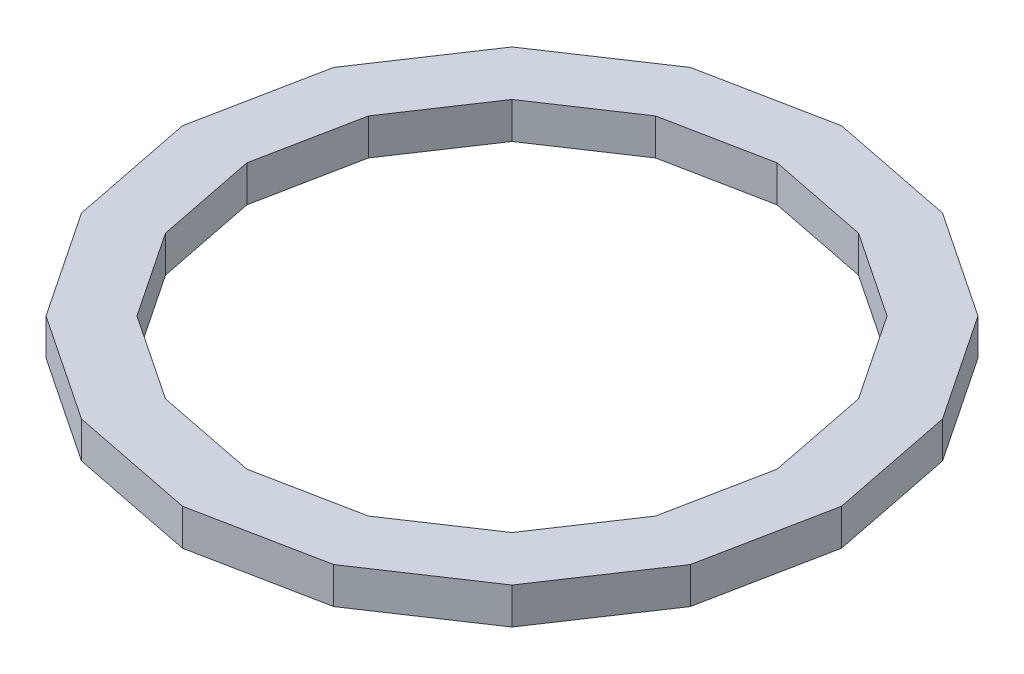
ISO-10303-21;
HEADER;
FILE_DESCRIPTION(('STEP AP214'),'2;1');
FILE_NAME('part.step','',(''),(''),'','','');
FILE_SCHEMA(('AUTOMOTIVE_DESIGN { 1 0 10303 214 1 1 1 1 }'));
ENDSEC;
DATA;
#1=APPLICATION_CONTEXT('core data for automotive mechanical design processes');
#2=APPLICATION_PROTOCOL_DEFINITION('international standard','automotive_design',2000,#1);
#3=PRODUCT_CONTEXT('',#1,'mechanical');
#4=PRODUCT('Part','Part','',(#3));
#5=PRODUCT_RELATED_PRODUCT_CATEGORY('part','',(#4));
#6=PRODUCT_DEFINITION_FORMATION('','',#4);
#7=PRODUCT_DEFINITION_CONTEXT('part definition',#1,'design');
#8=PRODUCT_DEFINITION('design','',#6,#7);
#9=PRODUCT_DEFINITION_SHAPE('','',#8);
#10=(LENGTH_UNIT() NAMED_UNIT(*) SI_UNIT(.MILLI.,.METRE.));
#11=(NAMED_UNIT(*) PLANE_ANGLE_UNIT() SI_UNIT($,.RADIAN.));
#12=(NAMED_UNIT(*) SI_UNIT($,.STERADIAN.) SOLID_ANGLE_UNIT());
#13=UNCERTAINTY_MEASURE_WITH_UNIT(LENGTH_MEASURE(1.E-05),#10,'distance_accuracy_value','');
#14=(GEOMETRIC_REPRESENTATION_CONTEXT(3) GLOBAL_UNCERTAINTY_ASSIGNED_CONTEXT((#13)) GLOBAL_UNIT_ASSIGNED_CONTEXT((#10,
#11,#12)) REPRESENTATION_CONTEXT('',''));
#15=CARTESIAN_POINT('',(0.,0.,0.));
#16=DIRECTION('',(0.,0.,1.));
#17=DIRECTION('',(1.,0.,0.));
#18=AXIS2_PLACEMENT_3D('',#15,#16,#17);
#19=CARTESIAN_POINT('',(0.,19.05,0.));
#20=DIRECTION('',(0.,1.,0.));
#21=DIRECTION('',(0.,0.,1.));
#22=AXIS2_PLACEMENT_3D('',#19,#20,#21);
#23=PLANE('',#22);
#24=DIRECTION('',(0.195090322016118,0.,-0.980785280403233));
#25=VECTOR('',#24,1.);
#26=CARTESIAN_POINT('',(159.378309212576,19.05,66.0166572239395));
#27=LINE('',#26,#25);
#28=CARTESIAN_POINT('',(159.378309212576,19.05,66.0166572239395));
#29=VERTEX_POINT('',#28);
#30=CARTESIAN_POINT('',(172.50983878748,19.05,-1.92207104317221E-12));
#31=VERTEX_POINT('',#30);
#32=EDGE_CURVE('E372',#29,#31,#27,.T.);
#33=ORIENTED_EDGE('',*,*,#32,.T.);
#34=DIRECTION('',(-0.19509032201614,0.,-0.980785280403228));
#35=VECTOR('',#34,1.);
#36=CARTESIAN_POINT('',(172.50983878748,19.05,-1.92207104317221E-12));
#37=LINE('',#36,#35);
#38=CARTESIAN_POINT('',(159.378309212574,19.05,-66.0166572239432));
#39=VERTEX_POINT('',#38);
#40=EDGE_CURVE('E375',#31,#39,#37,.T.);
#41=ORIENTED_EDGE('',*,*,#40,.T.);
#42=DIRECTION('',(-0.555570233019612,0.,-0.831469612302539));
#43=VECTOR('',#42,1.);
#44=CARTESIAN_POINT('',(159.378309212574,19.05,-66.0166572239432));
#45=LINE('',#44,#43);
#46=CARTESIAN_POINT('',(121.982876828024,19.05,-121.982876828027));
#47=VERTEX_POINT('',#46);
#48=EDGE_CURVE('E378',#39,#47,#45,.T.);
#49=ORIENTED_EDGE('',*,*,#48,.T.);
#50=DIRECTION('',(-0.831469612302552,0.,-0.555570233019593));
#51=VECTOR('',#50,1.);
#52=CARTESIAN_POINT('',(121.982876828024,19.05,-121.982876828027));
#53=LINE('',#52,#51);
#54=CARTESIAN_POINT('',(66.0166572239395,19.05,-159.378309212576));
#55=VERTEX_POINT('',#54);
#56=EDGE_CURVE('E380',#47,#55,#53,.T.);
#57=ORIENTED_EDGE('',*,*,#56,.T.);
#58=DIRECTION('',(-0.980785280403233,0.,-0.195090322016117));
#59=VECTOR('',#58,1.);
#60=CARTESIAN_POINT('',(66.0166572239395,19.05,-159.378309212576));
#61=LINE('',#60,#59);
#62=CARTESIAN_POINT('',(-1.90247239332931E-12,19.05,-172.50983878748));
#63=VERTEX_POINT('',#62);
#64=EDGE_CURVE('E382',#55,#63,#61,.T.);
#65=ORIENTED_EDGE('',*,*,#64,.T.);
#66=DIRECTION('',(-0.980785280403228,0.,0.19509032201614));
#67=VECTOR('',#66,1.);
#68=CARTESIAN_POINT('',(-1.90247239332931E-12,19.05,-172.50983878748));
#69=LINE('',#68,#67);
#70=CARTESIAN_POINT('',(-66.0166572239432,19.05,-159.378309212574));
#71=VERTEX_POINT('',#70);
#72=EDGE_CURVE('E384',#63,#71,#69,.T.);
#73=ORIENTED_EDGE('',*,*,#72,.T.);
#74=DIRECTION('',(-0.831469612302539,0.,0.555570233019612));
#75=VECTOR('',#74,1.);
#76=CARTESIAN_POINT('',(-66.0166572239432,19.05,-159.378309212574));
#77=LINE('',#76,#75);
#78=CARTESIAN_POINT('',(-121.982876828027,19.05,-121.982876828024));
#79=VERTEX_POINT('',#78);
#80=EDGE_CURVE('E386',#71,#79,#77,.T.);
#81=ORIENTED_EDGE('',*,*,#80,.T.);
#82=DIRECTION('',(-0.555570233019593,0.,0.831469612302552));
#83=VECTOR('',#82,1.);
#84=CARTESIAN_POINT('',(-121.982876828027,19.05,-121.982876828024));
#85=LINE('',#84,#83);
#86=CARTESIAN_POINT('',(-159.378309212576,19.05,-66.0166572239395));
#87=VERTEX_POINT('',#86);
#88=EDGE_CURVE('E388',#79,#87,#85,.T.);
#89=ORIENTED_EDGE('',*,*,#88,.T.);
#90=DIRECTION('',(-0.195090322016117,0.,0.980785280403233));
#91=VECTOR('',#90,1.);
#92=CARTESIAN_POINT('',(-159.378309212576,19.05,-66.0166572239395));
#93=LINE('',#92,#91);
#94=CARTESIAN_POINT('',(-172.50983878748,19.05,1.92980582097801E-12));
#95=VERTEX_POINT('',#94);
#96=EDGE_CURVE('E391',#87,#95,#93,.T.);
#97=ORIENTED_EDGE('',*,*,#96,.T.);
#98=DIRECTION('',(0.195090322016139,0.,0.980785280403228));
#99=VECTOR('',#98,1.);
#100=CARTESIAN_POINT('',(-172.50983878748,19.05,1.92980582097801E-12));
#101=LINE('',#100,#99);
#102=CARTESIAN_POINT('',(-159.378309212574,19.05,66.0166572239431));
#103=VERTEX_POINT('',#102);
#104=EDGE_CURVE('E393',#95,#103,#101,.T.);
#105=ORIENTED_EDGE('',*,*,#104,.T.);
#106=DIRECTION('',(0.555570233019612,0.,0.831469612302539));
#107=VECTOR('',#106,1.);
#108=CARTESIAN_POINT('',(-159.378309212574,19.05,66.0166572239431));
#109=LINE('',#108,#107);
#110=CARTESIAN_POINT('',(-121.982876828024,19.05,121.982876828027));
#111=VERTEX_POINT('',#110);
#112=EDGE_CURVE('E395',#103,#111,#109,.T.);
#113=ORIENTED_EDGE('',*,*,#112,.T.);
#114=DIRECTION('',(0.831469612302552,0.,0.555570233019593));
#115=VECTOR('',#114,1.);
#116=CARTESIAN_POINT('',(-121.982876828024,19.05,121.982876828027));
#117=LINE('',#116,#115);
#118=CARTESIAN_POINT('',(-66.0166572239395,19.05,159.378309212576));
#119=VERTEX_POINT('',#118);
#120=EDGE_CURVE('E398',#111,#119,#117,.T.);
#121=ORIENTED_EDGE('',*,*,#120,.T.);
#122=DIRECTION('',(0.980785280403233,0.,0.195090322016117));
#123=VECTOR('',#122,1.);
#124=CARTESIAN_POINT('',(-66.0166572239395,19.05,159.378309212576));
#125=LINE('',#124,#123);
#126=CARTESIAN_POINT('',(1.87475637863345E-12,19.05,172.50983878748));
#127=VERTEX_POINT('',#126);
#128=EDGE_CURVE('E401',#119,#127,#125,.T.);
#129=ORIENTED_EDGE('',*,*,#128,.T.);
#130=DIRECTION('',(0.980785280403228,0.,-0.19509032201614));
#131=VECTOR('',#130,1.);
#132=CARTESIAN_POINT('',(1.87475637863345E-12,19.05,172.50983878748));
#133=LINE('',#132,#131);
#134=CARTESIAN_POINT('',(66.0166572239431,19.05,159.378309212574));
#135=VERTEX_POINT('',#134);
#136=EDGE_CURVE('E403',#127,#135,#133,.T.);
#137=ORIENTED_EDGE('',*,*,#136,.T.);
#138=DIRECTION('',(0.831469612302539,0.,-0.555570233019612));
#139=VECTOR('',#138,1.);
#140=CARTESIAN_POINT('',(66.0166572239431,19.05,159.378309212574));
#141=LINE('',#140,#139);
#142=CARTESIAN_POINT('',(121.982876828027,19.05,121.982876828024));
#143=VERTEX_POINT('',#142);
#144=EDGE_CURVE('E406',#135,#143,#141,.T.);
#145=ORIENTED_EDGE('',*,*,#144,.T.);
#146=DIRECTION('',(0.555570233019593,0.,-0.831469612302551));
#147=VECTOR('',#146,1.);
#148=CARTESIAN_POINT('',(121.982876828027,19.05,121.982876828024));
#149=LINE('',#148,#147);
#150=EDGE_CURVE('E409',#143,#29,#149,.T.);
#151=ORIENTED_EDGE('',*,*,#150,.T.);
#152=EDGE_LOOP('',(#33,#41,#49,#57,#65,#73,#81,#89,#97,#105,#113,#121,#129,#137,#145,#151));
#153=FACE_BOUND('',#152,.T.);
#154=DIRECTION('',(-0.19509032201614,0.,-0.980785280403228));
#155=VECTOR('',#154,1.);
#156=CARTESIAN_POINT('',(138.842938743442,19.05,-1.68605097273448E-12));
#157=LINE('',#156,#155);
#158=CARTESIAN_POINT('',(138.842938743442,19.05,-1.68605097273448E-12));
#159=VERTEX_POINT('',#158);
#160=CARTESIAN_POINT('',(128.274149338784,19.05,-53.1328923579977));
#161=VERTEX_POINT('',#160);
#162=EDGE_CURVE('E252',#159,#161,#157,.T.);
#163=ORIENTED_EDGE('',*,*,#162,.F.);
#164=DIRECTION('',(0.195090322016117,0.,-0.980785280403233));
#165=VECTOR('',#164,1.);
#166=CARTESIAN_POINT('',(128.274149338785,19.05,53.1328923579948));
#167=LINE('',#166,#165);
#168=CARTESIAN_POINT('',(128.274149338785,19.05,53.1328923579948));
#169=VERTEX_POINT('',#168);
#170=EDGE_CURVE('E243',#169,#159,#167,.T.);
#171=ORIENTED_EDGE('',*,*,#170,.F.);
#172=DIRECTION('',(0.555570233019593,0.,-0.831469612302552));
#173=VECTOR('',#172,1.);
#174=CARTESIAN_POINT('',(98.1767835053572,19.05,98.176783505355));
#175=LINE('',#174,#173);
#176=CARTESIAN_POINT('',(98.1767835053573,19.05,98.176783505355));
#177=VERTEX_POINT('',#176);
#178=EDGE_CURVE('E297',#177,#169,#175,.T.);
#179=ORIENTED_EDGE('',*,*,#178,.F.);
#180=DIRECTION('',(0.831469612302539,0.,-0.555570233019612));
#181=VECTOR('',#180,1.);
#182=CARTESIAN_POINT('',(53.1328923579976,19.05,128.274149338784));
#183=LINE('',#182,#181);
#184=CARTESIAN_POINT('',(53.1328923579976,19.05,128.274149338784));
#185=VERTEX_POINT('',#184);
#186=EDGE_CURVE('E295',#185,#177,#183,.T.);
#187=ORIENTED_EDGE('',*,*,#186,.F.);
#188=DIRECTION('',(0.980785280403228,0.,-0.195090322016139));
#189=VECTOR('',#188,1.);
#190=CARTESIAN_POINT('',(1.57183347493308E-12,19.05,138.842938743442));
#191=LINE('',#190,#189);
#192=CARTESIAN_POINT('',(1.57183347493308E-12,19.05,138.842938743442));
#193=VERTEX_POINT('',#192);
#194=EDGE_CURVE('E293',#193,#185,#191,.T.);
#195=ORIENTED_EDGE('',*,*,#194,.F.);
#196=DIRECTION('',(0.980785280403233,0.,0.195090322016117));
#197=VECTOR('',#196,1.);
#198=CARTESIAN_POINT('',(-53.1328923579948,19.05,128.274149338785));
#199=LINE('',#198,#197);
#200=CARTESIAN_POINT('',(-53.1328923579948,19.05,128.274149338785));
#201=VERTEX_POINT('',#200);
#202=EDGE_CURVE('E290',#201,#193,#199,.T.);
#203=ORIENTED_EDGE('',*,*,#202,.F.);
#204=DIRECTION('',(0.831469612302551,0.,0.555570233019593));
#205=VECTOR('',#204,1.);
#206=CARTESIAN_POINT('',(-98.1767835053551,19.05,98.1767835053572));
#207=LINE('',#206,#205);
#208=CARTESIAN_POINT('',(-98.1767835053551,19.05,98.1767835053572));
#209=VERTEX_POINT('',#208);
#210=EDGE_CURVE('E288',#209,#201,#207,.T.);
#211=ORIENTED_EDGE('',*,*,#210,.F.);
#212=DIRECTION('',(0.555570233019612,0.,0.831469612302539));
#213=VECTOR('',#212,1.);
#214=CARTESIAN_POINT('',(-128.274149338784,19.05,53.1328923579977));
#215=LINE('',#214,#213);
#216=CARTESIAN_POINT('',(-128.274149338784,19.05,53.1328923579977));
#217=VERTEX_POINT('',#216);
#218=EDGE_CURVE('E286',#217,#209,#215,.T.);
#219=ORIENTED_EDGE('',*,*,#218,.F.);
#220=DIRECTION('',(0.19509032201614,0.,0.980785280403228));
#221=VECTOR('',#220,1.);
#222=CARTESIAN_POINT('',(-138.842938743442,19.05,1.59554962231287E-12));
#223=LINE('',#222,#221);
#224=CARTESIAN_POINT('',(-138.842938743442,19.05,1.59554962231287E-12));
#225=VERTEX_POINT('',#224);
#226=EDGE_CURVE('E284',#225,#217,#223,.T.);
#227=ORIENTED_EDGE('',*,*,#226,.F.);
#228=DIRECTION('',(-0.195090322016117,0.,0.980785280403233));
#229=VECTOR('',#228,1.);
#230=CARTESIAN_POINT('',(-128.274149338785,19.05,-53.1328923579948));
#231=LINE('',#230,#229);
#232=CARTESIAN_POINT('',(-128.274149338785,19.05,-53.1328923579948));
#233=VERTEX_POINT('',#232);
#234=EDGE_CURVE('E281',#233,#225,#231,.T.);
#235=ORIENTED_EDGE('',*,*,#234,.F.);
#236=DIRECTION('',(-0.555570233019593,0.,0.831469612302552));
#237=VECTOR('',#236,1.);
#238=CARTESIAN_POINT('',(-98.1767835053574,19.05,-98.176783505355));
#239=LINE('',#238,#237);
#240=CARTESIAN_POINT('',(-98.1767835053574,19.05,-98.176783505355));
#241=VERTEX_POINT('',#240);
#242=EDGE_CURVE('E278',#241,#233,#239,.T.);
#243=ORIENTED_EDGE('',*,*,#242,.F.);
#244=DIRECTION('',(-0.831469612302539,0.,0.555570233019612));
#245=VECTOR('',#244,1.);
#246=CARTESIAN_POINT('',(-53.1328923579977,19.05,-128.274149338784));
#247=LINE('',#246,#245);
#248=CARTESIAN_POINT('',(-53.1328923579977,19.05,-128.274149338784));
#249=VERTEX_POINT('',#248);
#250=EDGE_CURVE('E276',#249,#241,#247,.T.);
#251=ORIENTED_EDGE('',*,*,#250,.F.);
#252=DIRECTION('',(-0.980785280403228,0.,0.19509032201614));
#253=VECTOR('',#252,1.);
#254=CARTESIAN_POINT('',(-1.60267763885593E-12,19.05,-138.842938743442));
#255=LINE('',#254,#253);
#256=CARTESIAN_POINT('',(-1.60267763885593E-12,19.05,-138.842938743442));
#257=VERTEX_POINT('',#256);
#258=EDGE_CURVE('E273',#257,#249,#255,.T.);
#259=ORIENTED_EDGE('',*,*,#258,.F.);
#260=DIRECTION('',(-0.980785280403233,0.,-0.195090322016117));
#261=VECTOR('',#260,1.);
#262=CARTESIAN_POINT('',(53.1328923579946,19.05,-128.274149338785));
#263=LINE('',#262,#261);
#264=CARTESIAN_POINT('',(53.1328923579946,19.05,-128.274149338785));
#265=VERTEX_POINT('',#264);
#266=EDGE_CURVE('E271',#265,#257,#263,.T.);
#267=ORIENTED_EDGE('',*,*,#266,.F.);
#268=DIRECTION('',(-0.831469612302552,0.,-0.555570233019593));
#269=VECTOR('',#268,1.);
#270=CARTESIAN_POINT('',(98.176783505355,19.05,-98.1767835053572));
#271=LINE('',#270,#269);
#272=CARTESIAN_POINT('',(98.176783505355,19.05,-98.1767835053572));
#273=VERTEX_POINT('',#272);
#274=EDGE_CURVE('E267',#273,#265,#271,.T.);
#275=ORIENTED_EDGE('',*,*,#274,.F.);
#276=DIRECTION('',(-0.555570233019612,0.,-0.831469612302539));
#277=VECTOR('',#276,1.);
#278=CARTESIAN_POINT('',(128.274149338784,19.05,-53.1328923579977));
#279=LINE('',#278,#277);
#280=EDGE_CURVE('E265',#161,#273,#279,.T.);
#281=ORIENTED_EDGE('',*,*,#280,.F.);
#282=EDGE_LOOP('',(#163,#171,#179,#187,#195,#203,#211,#219,#227,#235,#243,#251,#259,#267,#275,#281));
#283=FACE_BOUND('',#282,.T.);
#284=ADVANCED_FACE('F34',(#153,#283),#23,.T.);
#285=CARTESIAN_POINT('',(0.,0.,0.));
#286=DIRECTION('',(0.,1.,0.));
#287=DIRECTION('',(0.,0.,1.));
#288=AXIS2_PLACEMENT_3D('',#285,#286,#287);
#289=PLANE('',#288);
#290=DIRECTION('',(0.195090322016118,0.,-0.980785280403233));
#291=VECTOR('',#290,1.);
#292=CARTESIAN_POINT('',(159.378309212576,0.,66.0166572239395));
#293=LINE('',#292,#291);
#294=CARTESIAN_POINT('',(159.378309212576,0.,66.0166572239395));
#295=VERTEX_POINT('',#294);
#296=CARTESIAN_POINT('',(172.50983878748,0.,-1.92207104317221E-12));
#297=VERTEX_POINT('',#296);
#298=EDGE_CURVE('E260',#295,#297,#293,.T.);
#299=ORIENTED_EDGE('',*,*,#298,.F.);
#300=DIRECTION('',(0.555570233019593,0.,-0.831469612302551));
#301=VECTOR('',#300,1.);
#302=CARTESIAN_POINT('',(121.982876828027,0.,121.982876828024));
#303=LINE('',#302,#301);
#304=CARTESIAN_POINT('',(121.982876828027,0.,121.982876828024));
#305=VERTEX_POINT('',#304);
#306=EDGE_CURVE('E376',#305,#295,#303,.T.);
#307=ORIENTED_EDGE('',*,*,#306,.F.);
#308=DIRECTION('',(0.831469612302539,0.,-0.555570233019612));
#309=VECTOR('',#308,1.);
#310=CARTESIAN_POINT('',(66.0166572239431,0.,159.378309212574));
#311=LINE('',#310,#309);
#312=CARTESIAN_POINT('',(66.0166572239431,0.,159.378309212574));
#313=VERTEX_POINT('',#312);
#314=EDGE_CURVE('E446',#313,#305,#311,.T.);
#315=ORIENTED_EDGE('',*,*,#314,.F.);
#316=DIRECTION('',(0.980785280403228,0.,-0.19509032201614));
#317=VECTOR('',#316,1.);
#318=CARTESIAN_POINT('',(1.87475637863345E-12,0.,172.50983878748));
#319=LINE('',#318,#317);
#320=CARTESIAN_POINT('',(1.87475637863345E-12,0.,172.50983878748));
#321=VERTEX_POINT('',#320);
#322=EDGE_CURVE('E443',#321,#313,#319,.T.);
#323=ORIENTED_EDGE('',*,*,#322,.F.);
#324=DIRECTION('',(0.980785280403233,0.,0.195090322016117));
#325=VECTOR('',#324,1.);
#326=CARTESIAN_POINT('',(-66.0166572239395,0.,159.378309212576));
#327=LINE('',#326,#325);
#328=CARTESIAN_POINT('',(-66.0166572239395,0.,159.378309212576));
#329=VERTEX_POINT('',#328);
#330=EDGE_CURVE('E440',#329,#321,#327,.T.);
#331=ORIENTED_EDGE('',*,*,#330,.F.);
#332=DIRECTION('',(0.831469612302552,0.,0.555570233019593));
#333=VECTOR('',#332,1.);
#334=CARTESIAN_POINT('',(-121.982876828024,0.,121.982876828027));
#335=LINE('',#334,#333);
#336=CARTESIAN_POINT('',(-121.982876828024,0.,121.982876828027));
#337=VERTEX_POINT('',#336);
#338=EDGE_CURVE('E437',#337,#329,#335,.T.);
#339=ORIENTED_EDGE('',*,*,#338,.F.);
#340=DIRECTION('',(0.555570233019612,0.,0.831469612302539));
#341=VECTOR('',#340,1.);
#342=CARTESIAN_POINT('',(-159.378309212574,0.,66.0166572239431));
#343=LINE('',#342,#341);
#344=CARTESIAN_POINT('',(-159.378309212574,0.,66.0166572239431));
#345=VERTEX_POINT('',#344);
#346=EDGE_CURVE('E435',#345,#337,#343,.T.);
#347=ORIENTED_EDGE('',*,*,#346,.F.);
#348=DIRECTION('',(0.195090322016139,0.,0.980785280403228));
#349=VECTOR('',#348,1.);
#350=CARTESIAN_POINT('',(-172.50983878748,0.,1.92980582097801E-12));
#351=LINE('',#350,#349);
#352=CARTESIAN_POINT('',(-172.50983878748,0.,1.92980582097801E-12));
#353=VERTEX_POINT('',#352);
#354=EDGE_CURVE('E432',#353,#345,#351,.T.);
#355=ORIENTED_EDGE('',*,*,#354,.F.);
#356=DIRECTION('',(-0.195090322016117,0.,0.980785280403233));
#357=VECTOR('',#356,1.);
#358=CARTESIAN_POINT('',(-159.378309212576,0.,-66.0166572239395));
#359=LINE('',#358,#357);
#360=CARTESIAN_POINT('',(-159.378309212576,0.,-66.0166572239395));
#361=VERTEX_POINT('',#360);
#362=EDGE_CURVE('E429',#361,#353,#359,.T.);
#363=ORIENTED_EDGE('',*,*,#362,.F.);
#364=DIRECTION('',(-0.555570233019593,0.,0.831469612302552));
#365=VECTOR('',#364,1.);
#366=CARTESIAN_POINT('',(-121.982876828027,0.,-121.982876828024));
#367=LINE('',#366,#365);
#368=CARTESIAN_POINT('',(-121.982876828027,0.,-121.982876828024));
#369=VERTEX_POINT('',#368);
#370=EDGE_CURVE('E426',#369,#361,#367,.T.);
#371=ORIENTED_EDGE('',*,*,#370,.F.);
#372=DIRECTION('',(-0.831469612302539,0.,0.555570233019612));
#373=VECTOR('',#372,1.);
#374=CARTESIAN_POINT('',(-66.0166572239432,0.,-159.378309212574));
#375=LINE('',#374,#373);
#376=CARTESIAN_POINT('',(-66.0166572239432,0.,-159.378309212574));
#377=VERTEX_POINT('',#376);
#378=EDGE_CURVE('E424',#377,#369,#375,.T.);
#379=ORIENTED_EDGE('',*,*,#378,.F.);
#380=DIRECTION('',(-0.980785280403228,0.,0.19509032201614));
#381=VECTOR('',#380,1.);
#382=CARTESIAN_POINT('',(-1.90247239332931E-12,0.,-172.50983878748));
#383=LINE('',#382,#381);
#384=CARTESIAN_POINT('',(-1.90247239332931E-12,0.,-172.50983878748));
#385=VERTEX_POINT('',#384);
#386=EDGE_CURVE('E422',#385,#377,#383,.T.);
#387=ORIENTED_EDGE('',*,*,#386,.F.);
#388=DIRECTION('',(-0.980785280403233,0.,-0.195090322016117));
#389=VECTOR('',#388,1.);
#390=CARTESIAN_POINT('',(66.0166572239395,0.,-159.378309212576));
#391=LINE('',#390,#389);
#392=CARTESIAN_POINT('',(66.0166572239395,0.,-159.378309212576));
#393=VERTEX_POINT('',#392);
#394=EDGE_CURVE('E420',#393,#385,#391,.T.);
#395=ORIENTED_EDGE('',*,*,#394,.F.);
#396=DIRECTION('',(-0.831469612302552,0.,-0.555570233019593));
#397=VECTOR('',#396,1.);
#398=CARTESIAN_POINT('',(121.982876828024,0.,-121.982876828027));
#399=LINE('',#398,#397);
#400=CARTESIAN_POINT('',(121.982876828024,0.,-121.982876828027));
#401=VERTEX_POINT('',#400);
#402=EDGE_CURVE('E418',#401,#393,#399,.T.);
#403=ORIENTED_EDGE('',*,*,#402,.F.);
#404=DIRECTION('',(-0.555570233019612,0.,-0.831469612302539));
#405=VECTOR('',#404,1.);
#406=CARTESIAN_POINT('',(159.378309212574,0.,-66.0166572239432));
#407=LINE('',#406,#405);
#408=CARTESIAN_POINT('',(159.378309212574,0.,-66.0166572239432));
#409=VERTEX_POINT('',#408);
#410=EDGE_CURVE('E416',#409,#401,#407,.T.);
#411=ORIENTED_EDGE('',*,*,#410,.F.);
#412=DIRECTION('',(-0.19509032201614,0.,-0.980785280403228));
#413=VECTOR('',#412,1.);
#414=CARTESIAN_POINT('',(172.50983878748,0.,-1.92207104317221E-12));
#415=LINE('',#414,#413);
#416=EDGE_CURVE('E414',#297,#409,#415,.T.);
#417=ORIENTED_EDGE('',*,*,#416,.F.);
#418=EDGE_LOOP('',(#299,#307,#315,#323,#331,#339,#347,#355,#363,#371,#379,#387,#395,#403,#411,#417));
#419=FACE_BOUND('',#418,.T.);
#420=DIRECTION('',(0.195090322016117,0.,-0.980785280403233));
#421=VECTOR('',#420,1.);
#422=CARTESIAN_POINT('',(128.274149338785,0.,53.1328923579948));
#423=LINE('',#422,#421);
#424=CARTESIAN_POINT('',(128.274149338785,0.,53.1328923579948));
#425=VERTEX_POINT('',#424);
#426=CARTESIAN_POINT('',(138.842938743442,0.,-1.68605097273448E-12));
#427=VERTEX_POINT('',#426);
#428=EDGE_CURVE('E57',#425,#427,#423,.T.);
#429=ORIENTED_EDGE('',*,*,#428,.T.);
#430=DIRECTION('',(-0.19509032201614,0.,-0.980785280403228));
#431=VECTOR('',#430,1.);
#432=CARTESIAN_POINT('',(138.842938743442,0.,-1.68605097273448E-12));
#433=LINE('',#432,#431);
#434=CARTESIAN_POINT('',(128.274149338784,0.,-53.1328923579977));
#435=VERTEX_POINT('',#434);
#436=EDGE_CURVE('E259',#427,#435,#433,.T.);
#437=ORIENTED_EDGE('',*,*,#436,.T.);
#438=DIRECTION('',(-0.555570233019612,0.,-0.831469612302539));
#439=VECTOR('',#438,1.);
#440=CARTESIAN_POINT('',(128.274149338784,0.,-53.1328923579977));
#441=LINE('',#440,#439);
#442=CARTESIAN_POINT('',(98.176783505355,0.,-98.1767835053572));
#443=VERTEX_POINT('',#442);
#444=EDGE_CURVE('E301',#435,#443,#441,.T.);
#445=ORIENTED_EDGE('',*,*,#444,.T.);
#446=DIRECTION('',(-0.831469612302552,0.,-0.555570233019593));
#447=VECTOR('',#446,1.);
#448=CARTESIAN_POINT('',(98.176783505355,0.,-98.1767835053572));
#449=LINE('',#448,#447);
#450=CARTESIAN_POINT('',(53.1328923579946,0.,-128.274149338785));
#451=VERTEX_POINT('',#450);
#452=EDGE_CURVE('E304',#443,#451,#449,.T.);
#453=ORIENTED_EDGE('',*,*,#452,.T.);
#454=DIRECTION('',(-0.980785280403233,0.,-0.195090322016117));
#455=VECTOR('',#454,1.);
#456=CARTESIAN_POINT('',(53.1328923579946,0.,-128.274149338785));
#457=LINE('',#456,#455);
#458=CARTESIAN_POINT('',(-1.60267763885593E-12,0.,-138.842938743442));
#459=VERTEX_POINT('',#458);
#460=EDGE_CURVE('E307',#451,#459,#457,.T.);
#461=ORIENTED_EDGE('',*,*,#460,.T.);
#462=DIRECTION('',(-0.980785280403228,0.,0.19509032201614));
#463=VECTOR('',#462,1.);
#464=CARTESIAN_POINT('',(-1.60267763885593E-12,0.,-138.842938743442));
#465=LINE('',#464,#463);
#466=CARTESIAN_POINT('',(-53.1328923579977,0.,-128.274149338784));
#467=VERTEX_POINT('',#466);
#468=EDGE_CURVE('E310',#459,#467,#465,.T.);
#469=ORIENTED_EDGE('',*,*,#468,.T.);
#470=DIRECTION('',(-0.831469612302539,0.,0.555570233019612));
#471=VECTOR('',#470,1.);
#472=CARTESIAN_POINT('',(-53.1328923579977,0.,-128.274149338784));
#473=LINE('',#472,#471);
#474=CARTESIAN_POINT('',(-98.1767835053574,0.,-98.176783505355));
#475=VERTEX_POINT('',#474);
#476=EDGE_CURVE('E313',#467,#475,#473,.T.);
#477=ORIENTED_EDGE('',*,*,#476,.T.);
#478=DIRECTION('',(-0.555570233019593,0.,0.831469612302552));
#479=VECTOR('',#478,1.);
#480=CARTESIAN_POINT('',(-98.1767835053574,0.,-98.176783505355));
#481=LINE('',#480,#479);
#482=CARTESIAN_POINT('',(-128.274149338785,0.,-53.1328923579948));
#483=VERTEX_POINT('',#482);
#484=EDGE_CURVE('E316',#475,#483,#481,.T.);
#485=ORIENTED_EDGE('',*,*,#484,.T.);
#486=DIRECTION('',(-0.195090322016117,0.,0.980785280403233));
#487=VECTOR('',#486,1.);
#488=CARTESIAN_POINT('',(-128.274149338785,0.,-53.1328923579948));
#489=LINE('',#488,#487);
#490=CARTESIAN_POINT('',(-138.842938743442,0.,1.59554962231287E-12));
#491=VERTEX_POINT('',#490);
#492=EDGE_CURVE('E319',#483,#491,#489,.T.);
#493=ORIENTED_EDGE('',*,*,#492,.T.);
#494=DIRECTION('',(0.19509032201614,0.,0.980785280403228));
#495=VECTOR('',#494,1.);
#496=CARTESIAN_POINT('',(-138.842938743442,0.,1.59554962231287E-12));
#497=LINE('',#496,#495);
#498=CARTESIAN_POINT('',(-128.274149338784,0.,53.1328923579977));
#499=VERTEX_POINT('',#498);
#500=EDGE_CURVE('E323',#491,#499,#497,.T.);
#501=ORIENTED_EDGE('',*,*,#500,.T.);
#502=DIRECTION('',(0.555570233019612,0.,0.831469612302539));
#503=VECTOR('',#502,1.);
#504=CARTESIAN_POINT('',(-128.274149338784,0.,53.1328923579977));
#505=LINE('',#504,#503);
#506=CARTESIAN_POINT('',(-98.1767835053551,0.,98.1767835053572));
#507=VERTEX_POINT('',#506);
#508=EDGE_CURVE('E326',#499,#507,#505,.T.);
#509=ORIENTED_EDGE('',*,*,#508,.T.);
#510=DIRECTION('',(0.831469612302551,0.,0.555570233019593));
#511=VECTOR('',#510,1.);
#512=CARTESIAN_POINT('',(-98.1767835053551,0.,98.1767835053572));
#513=LINE('',#512,#511);
#514=CARTESIAN_POINT('',(-53.1328923579948,0.,128.274149338785));
#515=VERTEX_POINT('',#514);
#516=EDGE_CURVE('E329',#507,#515,#513,.T.);
#517=ORIENTED_EDGE('',*,*,#516,.T.);
#518=DIRECTION('',(0.980785280403233,0.,0.195090322016117));
#519=VECTOR('',#518,1.);
#520=CARTESIAN_POINT('',(-53.1328923579948,0.,128.274149338785));
#521=LINE('',#520,#519);
#522=CARTESIAN_POINT('',(1.57183347493308E-12,0.,138.842938743442));
#523=VERTEX_POINT('',#522);
#524=EDGE_CURVE('E332',#515,#523,#521,.T.);
#525=ORIENTED_EDGE('',*,*,#524,.T.);
#526=DIRECTION('',(0.980785280403228,0.,-0.195090322016139));
#527=VECTOR('',#526,1.);
#528=CARTESIAN_POINT('',(1.57183347493308E-12,0.,138.842938743442));
#529=LINE('',#528,#527);
#530=CARTESIAN_POINT('',(53.1328923579976,0.,128.274149338784));
#531=VERTEX_POINT('',#530);
#532=EDGE_CURVE('E335',#523,#531,#529,.T.);
#533=ORIENTED_EDGE('',*,*,#532,.T.);
#534=DIRECTION('',(0.831469612302539,0.,-0.555570233019612));
#535=VECTOR('',#534,1.);
#536=CARTESIAN_POINT('',(53.1328923579976,0.,128.274149338784));
#537=LINE('',#536,#535);
#538=CARTESIAN_POINT('',(98.1767835053572,0.,98.176783505355));
#539=VERTEX_POINT('',#538);
#540=EDGE_CURVE('E338',#531,#539,#537,.T.);
#541=ORIENTED_EDGE('',*,*,#540,.T.);
#542=DIRECTION('',(0.555570233019593,0.,-0.831469612302552));
#543=VECTOR('',#542,1.);
#544=CARTESIAN_POINT('',(98.1767835053572,0.,98.176783505355));
#545=LINE('',#544,#543);
#546=EDGE_CURVE('E253',#539,#425,#545,.T.);
#547=ORIENTED_EDGE('',*,*,#546,.T.);
#548=EDGE_LOOP('',(#429,#437,#445,#453,#461,#469,#477,#485,#493,#501,#509,#517,#525,#533,#541,#547));
#549=FACE_BOUND('',#548,.T.);
#550=ADVANCED_FACE('F503',(#419,#549),#289,.F.);
#551=CARTESIAN_POINT('',(159.378309212576,19.05,66.0166572239395));
#552=DIRECTION('',(-0.980785280403233,0.,-0.195090322016118));
#553=DIRECTION('',(-0.195090322016118,0.,0.980785280403233));
#554=AXIS2_PLACEMENT_3D('',#551,#552,#553);
#555=PLANE('',#554);
#556=ORIENTED_EDGE('',*,*,#298,.T.);
#557=DIRECTION('',(0.,-1.,0.));
#558=VECTOR('',#557,1.);
#559=CARTESIAN_POINT('',(172.50983878748,19.05,-1.92207104317221E-12));
#560=LINE('',#559,#558);
#561=EDGE_CURVE('E11',#31,#297,#560,.T.);
#562=ORIENTED_EDGE('',*,*,#561,.F.);
#563=ORIENTED_EDGE('',*,*,#32,.F.);
#564=DIRECTION('',(0.,-1.,0.));
#565=VECTOR('',#564,1.);
#566=CARTESIAN_POINT('',(159.378309212576,19.05,66.0166572239395));
#567=LINE('',#566,#565);
#568=EDGE_CURVE('E411',#29,#295,#567,.T.);
#569=ORIENTED_EDGE('',*,*,#568,.T.);
#570=EDGE_LOOP('',(#556,#562,#563,#569));
#571=FACE_BOUND('',#570,.T.);
#572=ADVANCED_FACE('F36',(#571),#555,.F.);
#573=CARTESIAN_POINT('',(172.50983878748,19.05,-1.92207104317221E-12));
#574=DIRECTION('',(-0.980785280403228,0.,0.19509032201614));
#575=DIRECTION('',(0.19509032201614,0.,0.980785280403228));
#576=AXIS2_PLACEMENT_3D('',#573,#574,#575);
#577=PLANE('',#576);
#578=ORIENTED_EDGE('',*,*,#416,.T.);
#579=DIRECTION('',(0.,-1.,0.));
#580=VECTOR('',#579,1.);
#581=CARTESIAN_POINT('',(159.378309212574,19.05,-66.0166572239432));
#582=LINE('',#581,#580);
#583=EDGE_CURVE('E42',#39,#409,#582,.T.);
#584=ORIENTED_EDGE('',*,*,#583,.F.);
#585=ORIENTED_EDGE('',*,*,#40,.F.);
#586=ORIENTED_EDGE('',*,*,#561,.T.);
#587=EDGE_LOOP('',(#578,#584,#585,#586));
#588=FACE_BOUND('',#587,.T.);
#589=ADVANCED_FACE('F520',(#588),#577,.F.);
#590=CARTESIAN_POINT('',(159.378309212574,19.05,-66.0166572239432));
#591=DIRECTION('',(-0.831469612302539,0.,0.555570233019612));
#592=DIRECTION('',(0.555570233019612,0.,0.831469612302539));
#593=AXIS2_PLACEMENT_3D('',#590,#591,#592);
#594=PLANE('',#593);
#595=ORIENTED_EDGE('',*,*,#410,.T.);
#596=DIRECTION('',(0.,-1.,0.));
#597=VECTOR('',#596,1.);
#598=CARTESIAN_POINT('',(121.982876828024,19.05,-121.982876828027));
#599=LINE('',#598,#597);
#600=EDGE_CURVE('E490',#47,#401,#599,.T.);
#601=ORIENTED_EDGE('',*,*,#600,.F.);
#602=ORIENTED_EDGE('',*,*,#48,.F.);
#603=ORIENTED_EDGE('',*,*,#583,.T.);
#604=EDGE_LOOP('',(#595,#601,#602,#603));
#605=FACE_BOUND('',#604,.T.);
#606=ADVANCED_FACE('F497',(#605),#594,.F.);
#607=CARTESIAN_POINT('',(121.982876828024,19.05,-121.982876828027));
#608=DIRECTION('',(-0.555570233019593,0.,0.831469612302552));
#609=DIRECTION('',(0.831469612302552,0.,0.555570233019593));
#610=AXIS2_PLACEMENT_3D('',#607,#608,#609);
#611=PLANE('',#610);
#612=ORIENTED_EDGE('',*,*,#402,.T.);
#613=DIRECTION('',(0.,-1.,0.));
#614=VECTOR('',#613,1.);
#615=CARTESIAN_POINT('',(66.0166572239395,19.05,-159.378309212576));
#616=LINE('',#615,#614);
#617=EDGE_CURVE('E486',#55,#393,#616,.T.);
#618=ORIENTED_EDGE('',*,*,#617,.F.);
#619=ORIENTED_EDGE('',*,*,#56,.F.);
#620=ORIENTED_EDGE('',*,*,#600,.T.);
#621=EDGE_LOOP('',(#612,#618,#619,#620));
#622=FACE_BOUND('',#621,.T.);
#623=ADVANCED_FACE('F509',(#622),#611,.F.);
#624=CARTESIAN_POINT('',(66.0166572239395,19.05,-159.378309212576));
#625=DIRECTION('',(-0.195090322016117,0.,0.980785280403233));
#626=DIRECTION('',(0.980785280403233,0.,0.195090322016117));
#627=AXIS2_PLACEMENT_3D('',#624,#625,#626);
#628=PLANE('',#627);
#629=ORIENTED_EDGE('',*,*,#394,.T.);
#630=DIRECTION('',(0.,-1.,0.));
#631=VECTOR('',#630,1.);
#632=CARTESIAN_POINT('',(-1.90247239332931E-12,19.05,-172.50983878748));
#633=LINE('',#632,#631);
#634=EDGE_CURVE('E483',#63,#385,#633,.T.);
#635=ORIENTED_EDGE('',*,*,#634,.F.);
#636=ORIENTED_EDGE('',*,*,#64,.F.);
#637=ORIENTED_EDGE('',*,*,#617,.T.);
#638=EDGE_LOOP('',(#629,#635,#636,#637));
#639=FACE_BOUND('',#638,.T.);
#640=ADVANCED_FACE('F513',(#639),#628,.F.);
#641=CARTESIAN_POINT('',(-1.90247239332931E-12,19.05,-172.50983878748));
#642=DIRECTION('',(0.19509032201614,0.,0.980785280403228));
#643=DIRECTION('',(0.980785280403228,0.,-0.19509032201614));
#644=AXIS2_PLACEMENT_3D('',#641,#642,#643);
#645=PLANE('',#644);
#646=ORIENTED_EDGE('',*,*,#386,.T.);
#647=DIRECTION('',(0.,-1.,0.));
#648=VECTOR('',#647,1.);
#649=CARTESIAN_POINT('',(-66.0166572239432,19.05,-159.378309212574));
#650=LINE('',#649,#648);
#651=EDGE_CURVE('E480',#71,#377,#650,.T.);
#652=ORIENTED_EDGE('',*,*,#651,.F.);
#653=ORIENTED_EDGE('',*,*,#72,.F.);
#654=ORIENTED_EDGE('',*,*,#634,.T.);
#655=EDGE_LOOP('',(#646,#652,#653,#654));
#656=FACE_BOUND('',#655,.T.);
#657=ADVANCED_FACE('F573',(#656),#645,.F.);
#658=CARTESIAN_POINT('',(-66.0166572239432,19.05,-159.378309212574));
#659=DIRECTION('',(0.555570233019612,0.,0.831469612302539));
#660=DIRECTION('',(0.831469612302539,0.,-0.555570233019612));
#661=AXIS2_PLACEMENT_3D('',#658,#659,#660);
#662=PLANE('',#661);
#663=ORIENTED_EDGE('',*,*,#378,.T.);
#664=DIRECTION('',(0.,-1.,0.));
#665=VECTOR('',#664,1.);
#666=CARTESIAN_POINT('',(-121.982876828027,19.05,-121.982876828024));
#667=LINE('',#666,#665);
#668=EDGE_CURVE('E477',#79,#369,#667,.T.);
#669=ORIENTED_EDGE('',*,*,#668,.F.);
#670=ORIENTED_EDGE('',*,*,#80,.F.);
#671=ORIENTED_EDGE('',*,*,#651,.T.);
#672=EDGE_LOOP('',(#663,#669,#670,#671));
#673=FACE_BOUND('',#672,.T.);
#674=ADVANCED_FACE('F570',(#673),#662,.F.);
#675=CARTESIAN_POINT('',(-121.982876828027,19.05,-121.982876828024));
#676=DIRECTION('',(0.831469612302552,0.,0.555570233019593));
#677=DIRECTION('',(0.555570233019593,0.,-0.831469612302552));
#678=AXIS2_PLACEMENT_3D('',#675,#676,#677);
#679=PLANE('',#678);
#680=ORIENTED_EDGE('',*,*,#370,.T.);
#681=DIRECTION('',(0.,-1.,0.));
#682=VECTOR('',#681,1.);
#683=CARTESIAN_POINT('',(-159.378309212576,19.05,-66.0166572239395));
#684=LINE('',#683,#682);
#685=EDGE_CURVE('E473',#87,#361,#684,.T.);
#686=ORIENTED_EDGE('',*,*,#685,.F.);
#687=ORIENTED_EDGE('',*,*,#88,.F.);
#688=ORIENTED_EDGE('',*,*,#668,.T.);
#689=EDGE_LOOP('',(#680,#686,#687,#688));
#690=FACE_BOUND('',#689,.T.);
#691=ADVANCED_FACE('F566',(#690),#679,.F.);
#692=CARTESIAN_POINT('',(-159.378309212576,19.05,-66.0166572239395));
#693=DIRECTION('',(0.980785280403233,0.,0.195090322016117));
#694=DIRECTION('',(0.195090322016117,0.,-0.980785280403233));
#695=AXIS2_PLACEMENT_3D('',#692,#693,#694);
#696=PLANE('',#695);
#697=ORIENTED_EDGE('',*,*,#362,.T.);
#698=DIRECTION('',(0.,-1.,0.));
#699=VECTOR('',#698,1.);
#700=CARTESIAN_POINT('',(-172.50983878748,19.05,1.92980582097801E-12));
#701=LINE('',#700,#699);
#702=EDGE_CURVE('E470',#95,#353,#701,.T.);
#703=ORIENTED_EDGE('',*,*,#702,.F.);
#704=ORIENTED_EDGE('',*,*,#96,.F.);
#705=ORIENTED_EDGE('',*,*,#685,.T.);
#706=EDGE_LOOP('',(#697,#703,#704,#705));
#707=FACE_BOUND('',#706,.T.);
#708=ADVANCED_FACE('F562',(#707),#696,.F.);
#709=CARTESIAN_POINT('',(-172.50983878748,19.05,1.92980582097801E-12));
#710=DIRECTION('',(0.980785280403228,0.,-0.195090322016139));
#711=DIRECTION('',(-0.195090322016139,0.,-0.980785280403228));
#712=AXIS2_PLACEMENT_3D('',#709,#710,#711);
#713=PLANE('',#712);
#714=ORIENTED_EDGE('',*,*,#354,.T.);
#715=DIRECTION('',(0.,-1.,0.));
#716=VECTOR('',#715,1.);
#717=CARTESIAN_POINT('',(-159.378309212574,19.05,66.0166572239431));
#718=LINE('',#717,#716);
#719=EDGE_CURVE('E466',#103,#345,#718,.T.);
#720=ORIENTED_EDGE('',*,*,#719,.F.);
#721=ORIENTED_EDGE('',*,*,#104,.F.);
#722=ORIENTED_EDGE('',*,*,#702,.T.);
#723=EDGE_LOOP('',(#714,#720,#721,#722));
#724=FACE_BOUND('',#723,.T.);
#725=ADVANCED_FACE('F557',(#724),#713,.F.);
#726=CARTESIAN_POINT('',(-159.378309212574,19.05,66.0166572239431));
#727=DIRECTION('',(0.831469612302539,0.,-0.555570233019612));
#728=DIRECTION('',(-0.555570233019612,0.,-0.831469612302539));
#729=AXIS2_PLACEMENT_3D('',#726,#727,#728);
#730=PLANE('',#729);
#731=ORIENTED_EDGE('',*,*,#346,.T.);
#732=DIRECTION('',(0.,-1.,0.));
#733=VECTOR('',#732,1.);
#734=CARTESIAN_POINT('',(-121.982876828024,19.05,121.982876828027));
#735=LINE('',#734,#733);
#736=EDGE_CURVE('E463',#111,#337,#735,.T.);
#737=ORIENTED_EDGE('',*,*,#736,.F.);
#738=ORIENTED_EDGE('',*,*,#112,.F.);
#739=ORIENTED_EDGE('',*,*,#719,.T.);
#740=EDGE_LOOP('',(#731,#737,#738,#739));
#741=FACE_BOUND('',#740,.T.);
#742=ADVANCED_FACE('F551',(#741),#730,.F.);
#743=CARTESIAN_POINT('',(-121.982876828024,19.05,121.982876828027));
#744=DIRECTION('',(0.555570233019593,0.,-0.831469612302551));
#745=DIRECTION('',(-0.831469612302552,0.,-0.555570233019593));
#746=AXIS2_PLACEMENT_3D('',#743,#744,#745);
#747=PLANE('',#746);
#748=ORIENTED_EDGE('',*,*,#338,.T.);
#749=DIRECTION('',(0.,-1.,0.));
#750=VECTOR('',#749,1.);
#751=CARTESIAN_POINT('',(-66.0166572239395,19.05,159.378309212576));
#752=LINE('',#751,#750);
#753=EDGE_CURVE('E460',#119,#329,#752,.T.);
#754=ORIENTED_EDGE('',*,*,#753,.F.);
#755=ORIENTED_EDGE('',*,*,#120,.F.);
#756=ORIENTED_EDGE('',*,*,#736,.T.);
#757=EDGE_LOOP('',(#748,#754,#755,#756));
#758=FACE_BOUND('',#757,.T.);
#759=ADVANCED_FACE('F547',(#758),#747,.F.);
#760=CARTESIAN_POINT('',(-66.0166572239395,19.05,159.378309212576));
#761=DIRECTION('',(0.195090322016117,0.,-0.980785280403233));
#762=DIRECTION('',(-0.980785280403233,0.,-0.195090322016117));
#763=AXIS2_PLACEMENT_3D('',#760,#761,#762);
#764=PLANE('',#763);
#765=ORIENTED_EDGE('',*,*,#330,.T.);
#766=DIRECTION('',(0.,-1.,0.));
#767=VECTOR('',#766,1.);
#768=CARTESIAN_POINT('',(1.87475637863345E-12,19.05,172.50983878748));
#769=LINE('',#768,#767);
#770=EDGE_CURVE('E457',#127,#321,#769,.T.);
#771=ORIENTED_EDGE('',*,*,#770,.F.);
#772=ORIENTED_EDGE('',*,*,#128,.F.);
#773=ORIENTED_EDGE('',*,*,#753,.T.);
#774=EDGE_LOOP('',(#765,#771,#772,#773));
#775=FACE_BOUND('',#774,.T.);
#776=ADVANCED_FACE('F542',(#775),#764,.F.);
#777=CARTESIAN_POINT('',(1.87475637863345E-12,19.05,172.50983878748));
#778=DIRECTION('',(-0.19509032201614,0.,-0.980785280403228));
#779=DIRECTION('',(-0.980785280403228,0.,0.19509032201614));
#780=AXIS2_PLACEMENT_3D('',#777,#778,#779);
#781=PLANE('',#780);
#782=ORIENTED_EDGE('',*,*,#322,.T.);
#783=DIRECTION('',(0.,-1.,0.));
#784=VECTOR('',#783,1.);
#785=CARTESIAN_POINT('',(66.0166572239431,19.05,159.378309212574));
#786=LINE('',#785,#784);
#787=EDGE_CURVE('E454',#135,#313,#786,.T.);
#788=ORIENTED_EDGE('',*,*,#787,.F.);
#789=ORIENTED_EDGE('',*,*,#136,.F.);
#790=ORIENTED_EDGE('',*,*,#770,.T.);
#791=EDGE_LOOP('',(#782,#788,#789,#790));
#792=FACE_BOUND('',#791,.T.);
#793=ADVANCED_FACE('F536',(#792),#781,.F.);
#794=CARTESIAN_POINT('',(66.0166572239431,19.05,159.378309212574));
#795=DIRECTION('',(-0.555570233019612,0.,-0.831469612302539));
#796=DIRECTION('',(-0.831469612302539,0.,0.555570233019612));
#797=AXIS2_PLACEMENT_3D('',#794,#795,#796);
#798=PLANE('',#797);
#799=ORIENTED_EDGE('',*,*,#314,.T.);
#800=DIRECTION('',(0.,-1.,0.));
#801=VECTOR('',#800,1.);
#802=CARTESIAN_POINT('',(121.982876828027,19.05,121.982876828024));
#803=LINE('',#802,#801);
#804=EDGE_CURVE('E451',#143,#305,#803,.T.);
#805=ORIENTED_EDGE('',*,*,#804,.F.);
#806=ORIENTED_EDGE('',*,*,#144,.F.);
#807=ORIENTED_EDGE('',*,*,#787,.T.);
#808=EDGE_LOOP('',(#799,#805,#806,#807));
#809=FACE_BOUND('',#808,.T.);
#810=ADVANCED_FACE('F532',(#809),#798,.F.);
#811=CARTESIAN_POINT('',(121.982876828027,19.05,121.982876828024));
#812=DIRECTION('',(-0.831469612302551,0.,-0.555570233019593));
#813=DIRECTION('',(-0.555570233019593,0.,0.831469612302551));
#814=AXIS2_PLACEMENT_3D('',#811,#812,#813);
#815=PLANE('',#814);
#816=ORIENTED_EDGE('',*,*,#306,.T.);
#817=ORIENTED_EDGE('',*,*,#568,.F.);
#818=ORIENTED_EDGE('',*,*,#150,.F.);
#819=ORIENTED_EDGE('',*,*,#804,.T.);
#820=EDGE_LOOP('',(#816,#817,#818,#819));
#821=FACE_BOUND('',#820,.T.);
#822=ADVANCED_FACE('F527',(#821),#815,.F.);
#823=CARTESIAN_POINT('',(128.274149338785,19.05,53.1328923579948));
#824=DIRECTION('',(-0.980785280403233,0.,-0.195090322016117));
#825=DIRECTION('',(-0.195090322016117,0.,0.980785280403233));
#826=AXIS2_PLACEMENT_3D('',#823,#824,#825);
#827=PLANE('',#826);
#828=ORIENTED_EDGE('',*,*,#428,.F.);
#829=DIRECTION('',(0.,-1.,0.));
#830=VECTOR('',#829,1.);
#831=CARTESIAN_POINT('',(128.274149338785,19.05,53.1328923579948));
#832=LINE('',#831,#830);
#833=EDGE_CURVE('E247',#169,#425,#832,.T.);
#834=ORIENTED_EDGE('',*,*,#833,.F.);
#835=ORIENTED_EDGE('',*,*,#170,.T.);
#836=DIRECTION('',(0.,-1.,0.));
#837=VECTOR('',#836,1.);
#838=CARTESIAN_POINT('',(138.842938743442,19.05,-1.68605097273448E-12));
#839=LINE('',#838,#837);
#840=EDGE_CURVE('E246',#159,#427,#839,.T.);
#841=ORIENTED_EDGE('',*,*,#840,.T.);
#842=EDGE_LOOP('',(#828,#834,#835,#841));
#843=FACE_BOUND('',#842,.T.);
#844=ADVANCED_FACE('F245',(#843),#827,.T.);
#845=CARTESIAN_POINT('',(138.842938743442,19.05,-1.68605097273448E-12));
#846=DIRECTION('',(-0.980785280403228,0.,0.19509032201614));
#847=DIRECTION('',(0.19509032201614,0.,0.980785280403228));
#848=AXIS2_PLACEMENT_3D('',#845,#846,#847);
#849=PLANE('',#848);
#850=ORIENTED_EDGE('',*,*,#436,.F.);
#851=ORIENTED_EDGE('',*,*,#840,.F.);
#852=ORIENTED_EDGE('',*,*,#162,.T.);
#853=DIRECTION('',(0.,-1.,0.));
#854=VECTOR('',#853,1.);
#855=CARTESIAN_POINT('',(128.274149338784,19.05,-53.1328923579977));
#856=LINE('',#855,#854);
#857=EDGE_CURVE('E261',#161,#435,#856,.T.);
#858=ORIENTED_EDGE('',*,*,#857,.T.);
#859=EDGE_LOOP('',(#850,#851,#852,#858));
#860=FACE_BOUND('',#859,.T.);
#861=ADVANCED_FACE('F256',(#860),#849,.T.);
#862=CARTESIAN_POINT('',(128.274149338784,19.05,-53.1328923579977));
#863=DIRECTION('',(-0.831469612302539,0.,0.555570233019612));
#864=DIRECTION('',(0.555570233019612,0.,0.831469612302539));
#865=AXIS2_PLACEMENT_3D('',#862,#863,#864);
#866=PLANE('',#865);
#867=ORIENTED_EDGE('',*,*,#444,.F.);
#868=ORIENTED_EDGE('',*,*,#857,.F.);
#869=ORIENTED_EDGE('',*,*,#280,.T.);
#870=DIRECTION('',(0.,-1.,0.));
#871=VECTOR('',#870,1.);
#872=CARTESIAN_POINT('',(98.176783505355,19.05,-98.1767835053572));
#873=LINE('',#872,#871);
#874=EDGE_CURVE('E369',#273,#443,#873,.T.);
#875=ORIENTED_EDGE('',*,*,#874,.T.);
#876=EDGE_LOOP('',(#867,#868,#869,#875));
#877=FACE_BOUND('',#876,.T.);
#878=ADVANCED_FACE('F655',(#877),#866,.T.);
#879=CARTESIAN_POINT('',(98.176783505355,19.05,-98.1767835053572));
#880=DIRECTION('',(-0.555570233019593,0.,0.831469612302552));
#881=DIRECTION('',(0.831469612302552,0.,0.555570233019593));
#882=AXIS2_PLACEMENT_3D('',#879,#880,#881);
#883=PLANE('',#882);
#884=ORIENTED_EDGE('',*,*,#452,.F.);
#885=ORIENTED_EDGE('',*,*,#874,.F.);
#886=ORIENTED_EDGE('',*,*,#274,.T.);
#887=DIRECTION('',(0.,-1.,0.));
#888=VECTOR('',#887,1.);
#889=CARTESIAN_POINT('',(53.1328923579946,19.05,-128.274149338785));
#890=LINE('',#889,#888);
#891=EDGE_CURVE('E367',#265,#451,#890,.T.);
#892=ORIENTED_EDGE('',*,*,#891,.T.);
#893=EDGE_LOOP('',(#884,#885,#886,#892));
#894=FACE_BOUND('',#893,.T.);
#895=ADVANCED_FACE('F661',(#894),#883,.T.);
#896=CARTESIAN_POINT('',(53.1328923579946,19.05,-128.274149338785));
#897=DIRECTION('',(-0.195090322016117,0.,0.980785280403233));
#898=DIRECTION('',(0.980785280403233,0.,0.195090322016117));
#899=AXIS2_PLACEMENT_3D('',#896,#897,#898);
#900=PLANE('',#899);
#901=ORIENTED_EDGE('',*,*,#460,.F.);
#902=ORIENTED_EDGE('',*,*,#891,.F.);
#903=ORIENTED_EDGE('',*,*,#266,.T.);
#904=DIRECTION('',(0.,-1.,0.));
#905=VECTOR('',#904,1.);
#906=CARTESIAN_POINT('',(-1.60267763885593E-12,19.05,-138.842938743442));
#907=LINE('',#906,#905);
#908=EDGE_CURVE('E365',#257,#459,#907,.T.);
#909=ORIENTED_EDGE('',*,*,#908,.T.);
#910=EDGE_LOOP('',(#901,#902,#903,#909));
#911=FACE_BOUND('',#910,.T.);
#912=ADVANCED_FACE('F669',(#911),#900,.T.);
#913=CARTESIAN_POINT('',(-1.60267763885593E-12,19.05,-138.842938743442));
#914=DIRECTION('',(0.19509032201614,0.,0.980785280403228));
#915=DIRECTION('',(0.980785280403228,0.,-0.19509032201614));
#916=AXIS2_PLACEMENT_3D('',#913,#914,#915);
#917=PLANE('',#916);
#918=ORIENTED_EDGE('',*,*,#468,.F.);
#919=ORIENTED_EDGE('',*,*,#908,.F.);
#920=ORIENTED_EDGE('',*,*,#258,.T.);
#921=DIRECTION('',(0.,-1.,0.));
#922=VECTOR('',#921,1.);
#923=CARTESIAN_POINT('',(-53.1328923579977,19.05,-128.274149338784));
#924=LINE('',#923,#922);
#925=EDGE_CURVE('E363',#249,#467,#924,.T.);
#926=ORIENTED_EDGE('',*,*,#925,.T.);
#927=EDGE_LOOP('',(#918,#919,#920,#926));
#928=FACE_BOUND('',#927,.T.);
#929=ADVANCED_FACE('F677',(#928),#917,.T.);
#930=CARTESIAN_POINT('',(-53.1328923579977,19.05,-128.274149338784));
#931=DIRECTION('',(0.555570233019612,0.,0.831469612302539));
#932=DIRECTION('',(0.831469612302539,0.,-0.555570233019612));
#933=AXIS2_PLACEMENT_3D('',#930,#931,#932);
#934=PLANE('',#933);
#935=ORIENTED_EDGE('',*,*,#476,.F.);
#936=ORIENTED_EDGE('',*,*,#925,.F.);
#937=ORIENTED_EDGE('',*,*,#250,.T.);
#938=DIRECTION('',(0.,-1.,0.));
#939=VECTOR('',#938,1.);
#940=CARTESIAN_POINT('',(-98.1767835053574,19.05,-98.176783505355));
#941=LINE('',#940,#939);
#942=EDGE_CURVE('E360',#241,#475,#941,.T.);
#943=ORIENTED_EDGE('',*,*,#942,.T.);
#944=EDGE_LOOP('',(#935,#936,#937,#943));
#945=FACE_BOUND('',#944,.T.);
#946=ADVANCED_FACE('F685',(#945),#934,.T.);
#947=CARTESIAN_POINT('',(-98.1767835053574,19.05,-98.176783505355));
#948=DIRECTION('',(0.831469612302552,0.,0.555570233019593));
#949=DIRECTION('',(0.555570233019593,0.,-0.831469612302552));
#950=AXIS2_PLACEMENT_3D('',#947,#948,#949);
#951=PLANE('',#950);
#952=ORIENTED_EDGE('',*,*,#484,.F.);
#953=ORIENTED_EDGE('',*,*,#942,.F.);
#954=ORIENTED_EDGE('',*,*,#242,.T.);
#955=DIRECTION('',(0.,-1.,0.));
#956=VECTOR('',#955,1.);
#957=CARTESIAN_POINT('',(-128.274149338785,19.05,-53.1328923579948));
#958=LINE('',#957,#956);
#959=EDGE_CURVE('E357',#233,#483,#958,.T.);
#960=ORIENTED_EDGE('',*,*,#959,.T.);
#961=EDGE_LOOP('',(#952,#953,#954,#960));
#962=FACE_BOUND('',#961,.T.);
#963=ADVANCED_FACE('F693',(#962),#951,.T.);
#964=CARTESIAN_POINT('',(-128.274149338785,19.05,-53.1328923579948));
#965=DIRECTION('',(0.980785280403233,0.,0.195090322016117));
#966=DIRECTION('',(0.195090322016117,0.,-0.980785280403233));
#967=AXIS2_PLACEMENT_3D('',#964,#965,#966);
#968=PLANE('',#967);
#969=ORIENTED_EDGE('',*,*,#492,.F.);
#970=ORIENTED_EDGE('',*,*,#959,.F.);
#971=ORIENTED_EDGE('',*,*,#234,.T.);
#972=DIRECTION('',(0.,-1.,0.));
#973=VECTOR('',#972,1.);
#974=CARTESIAN_POINT('',(-138.842938743442,19.05,1.59554962231287E-12));
#975=LINE('',#974,#973);
#976=EDGE_CURVE('E355',#225,#491,#975,.T.);
#977=ORIENTED_EDGE('',*,*,#976,.T.);
#978=EDGE_LOOP('',(#969,#970,#971,#977));
#979=FACE_BOUND('',#978,.T.);
#980=ADVANCED_FACE('F701',(#979),#968,.T.);
#981=CARTESIAN_POINT('',(-138.842938743442,19.05,1.59554962231287E-12));
#982=DIRECTION('',(0.980785280403228,0.,-0.19509032201614));
#983=DIRECTION('',(-0.19509032201614,0.,-0.980785280403228));
#984=AXIS2_PLACEMENT_3D('',#981,#982,#983);
#985=PLANE('',#984);
#986=ORIENTED_EDGE('',*,*,#500,.F.);
#987=ORIENTED_EDGE('',*,*,#976,.F.);
#988=ORIENTED_EDGE('',*,*,#226,.T.);
#989=DIRECTION('',(0.,-1.,0.));
#990=VECTOR('',#989,1.);
#991=CARTESIAN_POINT('',(-128.274149338784,19.05,53.1328923579977));
#992=LINE('',#991,#990);
#993=EDGE_CURVE('E353',#217,#499,#992,.T.);
#994=ORIENTED_EDGE('',*,*,#993,.T.);
#995=EDGE_LOOP('',(#986,#987,#988,#994));
#996=FACE_BOUND('',#995,.T.);
#997=ADVANCED_FACE('F709',(#996),#985,.T.);
#998=CARTESIAN_POINT('',(-128.274149338784,19.05,53.1328923579977));
#999=DIRECTION('',(0.831469612302539,0.,-0.555570233019612));
#1000=DIRECTION('',(-0.555570233019612,0.,-0.831469612302539));
#1001=AXIS2_PLACEMENT_3D('',#998,#999,#1000);
#1002=PLANE('',#1001);
#1003=ORIENTED_EDGE('',*,*,#508,.F.);
#1004=ORIENTED_EDGE('',*,*,#993,.F.);
#1005=ORIENTED_EDGE('',*,*,#218,.T.);
#1006=DIRECTION('',(0.,-1.,0.));
#1007=VECTOR('',#1006,1.);
#1008=CARTESIAN_POINT('',(-98.1767835053551,19.05,98.1767835053572));
#1009=LINE('',#1008,#1007);
#1010=EDGE_CURVE('E351',#209,#507,#1009,.T.);
#1011=ORIENTED_EDGE('',*,*,#1010,.T.);
#1012=EDGE_LOOP('',(#1003,#1004,#1005,#1011));
#1013=FACE_BOUND('',#1012,.T.);
#1014=ADVANCED_FACE('F717',(#1013),#1002,.T.);
#1015=CARTESIAN_POINT('',(-98.1767835053551,19.05,98.1767835053572));
#1016=DIRECTION('',(0.555570233019593,0.,-0.831469612302552));
#1017=DIRECTION('',(-0.831469612302552,0.,-0.555570233019593));
#1018=AXIS2_PLACEMENT_3D('',#1015,#1016,#1017);
#1019=PLANE('',#1018);
#1020=ORIENTED_EDGE('',*,*,#516,.F.);
#1021=ORIENTED_EDGE('',*,*,#1010,.F.);
#1022=ORIENTED_EDGE('',*,*,#210,.T.);
#1023=DIRECTION('',(0.,-1.,0.));
#1024=VECTOR('',#1023,1.);
#1025=CARTESIAN_POINT('',(-53.1328923579948,19.05,128.274149338785));
#1026=LINE('',#1025,#1024);
#1027=EDGE_CURVE('E349',#201,#515,#1026,.T.);
#1028=ORIENTED_EDGE('',*,*,#1027,.T.);
#1029=EDGE_LOOP('',(#1020,#1021,#1022,#1028));
#1030=FACE_BOUND('',#1029,.T.);
#1031=ADVANCED_FACE('F725',(#1030),#1019,.T.);
#1032=CARTESIAN_POINT('',(-53.1328923579948,19.05,128.274149338785));
#1033=DIRECTION('',(0.195090322016117,0.,-0.980785280403233));
#1034=DIRECTION('',(-0.980785280403233,0.,-0.195090322016117));
#1035=AXIS2_PLACEMENT_3D('',#1032,#1033,#1034);
#1036=PLANE('',#1035);
#1037=ORIENTED_EDGE('',*,*,#524,.F.);
#1038=ORIENTED_EDGE('',*,*,#1027,.F.);
#1039=ORIENTED_EDGE('',*,*,#202,.T.);
#1040=DIRECTION('',(0.,-1.,0.));
#1041=VECTOR('',#1040,1.);
#1042=CARTESIAN_POINT('',(1.57183347493308E-12,19.05,138.842938743442));
#1043=LINE('',#1042,#1041);
#1044=EDGE_CURVE('E347',#193,#523,#1043,.T.);
#1045=ORIENTED_EDGE('',*,*,#1044,.T.);
#1046=EDGE_LOOP('',(#1037,#1038,#1039,#1045));
#1047=FACE_BOUND('',#1046,.T.);
#1048=ADVANCED_FACE('F733',(#1047),#1036,.T.);
#1049=CARTESIAN_POINT('',(1.57183347493308E-12,19.05,138.842938743442));
#1050=DIRECTION('',(-0.195090322016139,0.,-0.980785280403228));
#1051=DIRECTION('',(-0.980785280403228,0.,0.195090322016139));
#1052=AXIS2_PLACEMENT_3D('',#1049,#1050,#1051);
#1053=PLANE('',#1052);
#1054=ORIENTED_EDGE('',*,*,#532,.F.);
#1055=ORIENTED_EDGE('',*,*,#1044,.F.);
#1056=ORIENTED_EDGE('',*,*,#194,.T.);
#1057=DIRECTION('',(0.,-1.,0.));
#1058=VECTOR('',#1057,1.);
#1059=CARTESIAN_POINT('',(53.1328923579976,19.05,128.274149338784));
#1060=LINE('',#1059,#1058);
#1061=EDGE_CURVE('E345',#185,#531,#1060,.T.);
#1062=ORIENTED_EDGE('',*,*,#1061,.T.);
#1063=EDGE_LOOP('',(#1054,#1055,#1056,#1062));
#1064=FACE_BOUND('',#1063,.T.);
#1065=ADVANCED_FACE('F741',(#1064),#1053,.T.);
#1066=CARTESIAN_POINT('',(53.1328923579976,19.05,128.274149338784));
#1067=DIRECTION('',(-0.555570233019612,0.,-0.831469612302539));
#1068=DIRECTION('',(-0.831469612302539,0.,0.555570233019612));
#1069=AXIS2_PLACEMENT_3D('',#1066,#1067,#1068);
#1070=PLANE('',#1069);
#1071=ORIENTED_EDGE('',*,*,#540,.F.);
#1072=ORIENTED_EDGE('',*,*,#1061,.F.);
#1073=ORIENTED_EDGE('',*,*,#186,.T.);
#1074=DIRECTION('',(0.,-1.,0.));
#1075=VECTOR('',#1074,1.);
#1076=CARTESIAN_POINT('',(98.1767835053572,19.05,98.176783505355));
#1077=LINE('',#1076,#1075);
#1078=EDGE_CURVE('E49',#177,#539,#1077,.T.);
#1079=ORIENTED_EDGE('',*,*,#1078,.T.);
#1080=EDGE_LOOP('',(#1071,#1072,#1073,#1079));
#1081=FACE_BOUND('',#1080,.T.);
#1082=ADVANCED_FACE('F749',(#1081),#1070,.T.);
#1083=CARTESIAN_POINT('',(98.1767835053572,19.05,98.176783505355));
#1084=DIRECTION('',(-0.831469612302552,0.,-0.555570233019593));
#1085=DIRECTION('',(-0.555570233019593,0.,0.831469612302552));
#1086=AXIS2_PLACEMENT_3D('',#1083,#1084,#1085);
#1087=PLANE('',#1086);
#1088=ORIENTED_EDGE('',*,*,#546,.F.);
#1089=ORIENTED_EDGE('',*,*,#1078,.F.);
#1090=ORIENTED_EDGE('',*,*,#178,.T.);
#1091=ORIENTED_EDGE('',*,*,#833,.T.);
#1092=EDGE_LOOP('',(#1088,#1089,#1090,#1091));
#1093=FACE_BOUND('',#1092,.T.);
#1094=ADVANCED_FACE('F757',(#1093),#1087,.T.);
#1095=CLOSED_SHELL('',(#284,#550,#572,#589,#606,#623,#640,#657,#674,#691,#708,#725,#742,#759,
#776,#793,#810,#822,#844,#861,#878,#895,#912,#929,#946,#963,#980,#997,#1014,#1031,#1048,#1065,
#1082,#1094));
#1096=MANIFOLD_SOLID_BREP('B2',#1095);
#1097=ADVANCED_BREP_SHAPE_REPRESENTATION('',(#18,#1096),#14);
#1098=SHAPE_DEFINITION_REPRESENTATION(#9,#1097);
ENDSEC;
END-ISO-10303-21;
